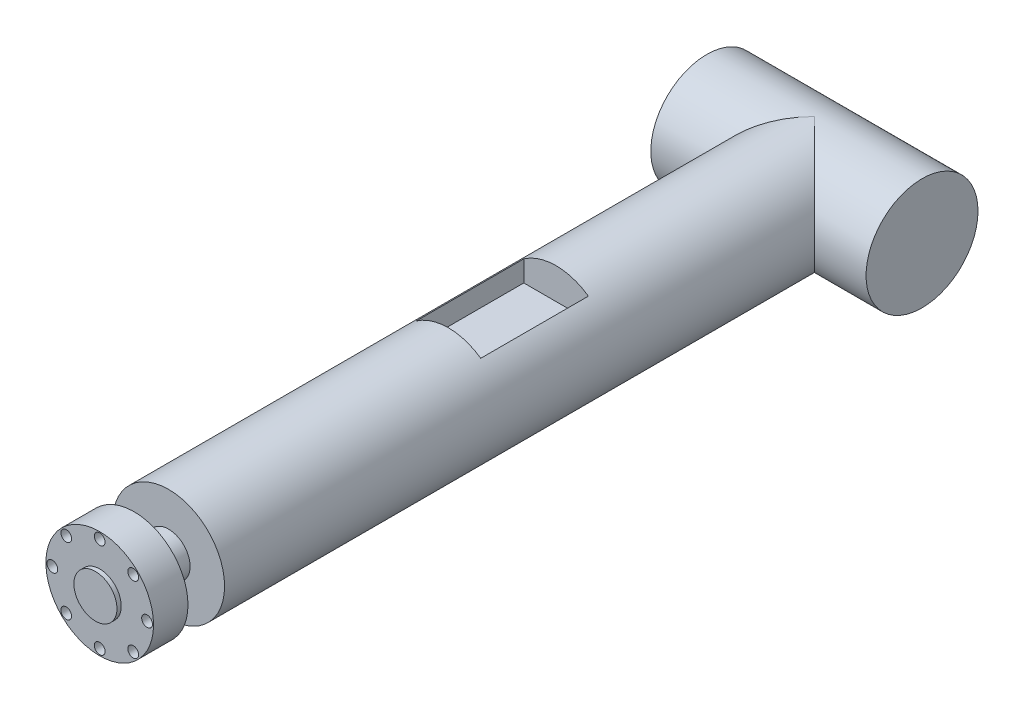
ISO-10303-21;
HEADER;
FILE_DESCRIPTION(('STEP AP214'),'2;1');
FILE_NAME('part.step','',(''),(''),'','','');
FILE_SCHEMA(('AUTOMOTIVE_DESIGN { 1 0 10303 214 1 1 1 1 }'));
ENDSEC;
DATA;
#1=APPLICATION_CONTEXT('core data for automotive mechanical design processes');
#2=APPLICATION_PROTOCOL_DEFINITION('international standard','automotive_design',2000,#1);
#3=PRODUCT_CONTEXT('',#1,'mechanical');
#4=PRODUCT('Part','Part','',(#3));
#5=PRODUCT_RELATED_PRODUCT_CATEGORY('part','',(#4));
#6=PRODUCT_DEFINITION_FORMATION('','',#4);
#7=PRODUCT_DEFINITION_CONTEXT('part definition',#1,'design');
#8=PRODUCT_DEFINITION('design','',#6,#7);
#9=PRODUCT_DEFINITION_SHAPE('','',#8);
#10=(LENGTH_UNIT() NAMED_UNIT(*) SI_UNIT(.MILLI.,.METRE.));
#11=(NAMED_UNIT(*) PLANE_ANGLE_UNIT() SI_UNIT($,.RADIAN.));
#12=(NAMED_UNIT(*) SI_UNIT($,.STERADIAN.) SOLID_ANGLE_UNIT());
#13=UNCERTAINTY_MEASURE_WITH_UNIT(LENGTH_MEASURE(1.E-05),#10,'distance_accuracy_value','');
#14=(GEOMETRIC_REPRESENTATION_CONTEXT(3) GLOBAL_UNCERTAINTY_ASSIGNED_CONTEXT((#13)) GLOBAL_UNIT_ASSIGNED_CONTEXT((#10,
#11,#12)) REPRESENTATION_CONTEXT('',''));
#15=CARTESIAN_POINT('',(0.,0.,0.));
#16=DIRECTION('',(0.,0.,1.));
#17=DIRECTION('',(1.,0.,0.));
#18=AXIS2_PLACEMENT_3D('',#15,#16,#17);
#19=CARTESIAN_POINT('',(0.,0.,150.));
#20=DIRECTION('',(0.,0.,-1.));
#21=DIRECTION('',(-1.,0.,0.));
#22=AXIS2_PLACEMENT_3D('',#19,#20,#21);
#23=CYLINDRICAL_SURFACE('',#22,13.);
#24=CARTESIAN_POINT('',(0.,0.,150.));
#25=DIRECTION('',(0.,0.,1.));
#26=DIRECTION('',(1.,0.,0.));
#27=AXIS2_PLACEMENT_3D('',#24,#25,#26);
#28=CIRCLE('',#27,13.);
#29=CARTESIAN_POINT('',(13.,0.,150.));
#30=VERTEX_POINT('',#29);
#31=EDGE_CURVE('E172',#30,#30,#28,.T.);
#32=ORIENTED_EDGE('',*,*,#31,.F.);
#33=EDGE_LOOP('',(#32));
#34=FACE_BOUND('',#33,.T.);
#35=CARTESIAN_POINT('',(0.,0.,0.));
#36=DIRECTION('',(0.707106781186547,0.,-0.707106781186547));
#37=DIRECTION('',(0.707106781186547,0.,0.707106781186547));
#38=AXIS2_PLACEMENT_3D('',#35,#36,#37);
#39=ELLIPSE('',#38,18.3847763108502,13.);
#40=CARTESIAN_POINT('',(0.,13.,0.));
#41=VERTEX_POINT('',#40);
#42=CARTESIAN_POINT('',(0.,-13.,0.));
#43=VERTEX_POINT('',#42);
#44=EDGE_CURVE('E56',#41,#43,#39,.T.);
#45=ORIENTED_EDGE('',*,*,#44,.F.);
#46=CARTESIAN_POINT('',(0.,0.,0.));
#47=DIRECTION('',(0.707106781186547,0.,0.707106781186547));
#48=DIRECTION('',(0.707106781186547,0.,-0.707106781186547));
#49=AXIS2_PLACEMENT_3D('',#46,#47,#48);
#50=ELLIPSE('',#49,18.3847763108502,13.);
#51=EDGE_CURVE('E186',#43,#41,#50,.F.);
#52=ORIENTED_EDGE('',*,*,#51,.F.);
#53=EDGE_LOOP('',(#45,#52));
#54=FACE_BOUND('',#53,.T.);
#55=DIRECTION('',(0.,0.,-1.));
#56=VECTOR('',#55,1.);
#57=CARTESIAN_POINT('',(7.49999999999998,10.6183802907977,150.));
#58=LINE('',#57,#56);
#59=CARTESIAN_POINT('',(7.5,10.6183802907977,59.9999999999999));
#60=VERTEX_POINT('',#59);
#61=CARTESIAN_POINT('',(7.5,10.6183802907977,84.9999999999999));
#62=VERTEX_POINT('',#61);
#63=EDGE_CURVE('E93',#60,#62,#58,.F.);
#64=ORIENTED_EDGE('',*,*,#63,.T.);
#65=CARTESIAN_POINT('',(0.,0.,85.));
#66=DIRECTION('',(0.,0.,-1.));
#67=DIRECTION('',(0.,1.,0.));
#68=AXIS2_PLACEMENT_3D('',#65,#66,#67);
#69=CIRCLE('',#68,13.);
#70=CARTESIAN_POINT('',(-7.5,10.6183802907977,84.9999999999999));
#71=VERTEX_POINT('',#70);
#72=EDGE_CURVE('E79',#62,#71,#69,.F.);
#73=ORIENTED_EDGE('',*,*,#72,.T.);
#74=DIRECTION('',(0.,0.,-1.));
#75=VECTOR('',#74,1.);
#76=CARTESIAN_POINT('',(-7.49999999999998,10.6183802907977,150.));
#77=LINE('',#76,#75);
#78=CARTESIAN_POINT('',(-7.49999999999998,10.6183802907977,59.9999999999999));
#79=VERTEX_POINT('',#78);
#80=EDGE_CURVE('E104',#71,#79,#77,.T.);
#81=ORIENTED_EDGE('',*,*,#80,.T.);
#82=CARTESIAN_POINT('',(0.,0.,60.));
#83=DIRECTION('',(0.,0.,1.));
#84=DIRECTION('',(0.,-1.,0.));
#85=AXIS2_PLACEMENT_3D('',#82,#83,#84);
#86=CIRCLE('',#85,13.);
#87=EDGE_CURVE('E100',#79,#60,#86,.F.);
#88=ORIENTED_EDGE('',*,*,#87,.T.);
#89=EDGE_LOOP('',(#64,#73,#81,#88));
#90=FACE_BOUND('',#89,.T.);
#91=ADVANCED_FACE('F33',(#34,#54,#90),#23,.T.);
#92=CARTESIAN_POINT('',(0.,0.,166.));
#93=DIRECTION('',(0.,0.,-1.));
#94=DIRECTION('',(-1.,0.,0.));
#95=AXIS2_PLACEMENT_3D('',#92,#93,#94);
#96=CYLINDRICAL_SURFACE('',#95,5.);
#97=CARTESIAN_POINT('',(0.,0.,150.));
#98=DIRECTION('',(0.,0.,1.));
#99=DIRECTION('',(1.,0.,0.));
#100=AXIS2_PLACEMENT_3D('',#97,#98,#99);
#101=CIRCLE('',#100,5.);
#102=CARTESIAN_POINT('',(5.,0.,150.));
#103=VERTEX_POINT('',#102);
#104=EDGE_CURVE('E175',#103,#103,#101,.T.);
#105=ORIENTED_EDGE('',*,*,#104,.T.);
#106=EDGE_LOOP('',(#105));
#107=FACE_BOUND('',#106,.T.);
#108=CARTESIAN_POINT('',(0.,0.,158.));
#109=DIRECTION('',(0.,0.,1.));
#110=DIRECTION('',(1.,0.,0.));
#111=AXIS2_PLACEMENT_3D('',#108,#109,#110);
#112=CIRCLE('',#111,5.);
#113=CARTESIAN_POINT('',(5.,0.,158.));
#114=VERTEX_POINT('',#113);
#115=EDGE_CURVE('E37',#114,#114,#112,.T.);
#116=ORIENTED_EDGE('',*,*,#115,.F.);
#117=EDGE_LOOP('',(#116));
#118=FACE_BOUND('',#117,.T.);
#119=ADVANCED_FACE('F189',(#107,#118),#96,.T.);
#120=CARTESIAN_POINT('',(-25.,0.,0.));
#121=DIRECTION('',(1.,0.,0.));
#122=DIRECTION('',(0.,0.,-1.));
#123=AXIS2_PLACEMENT_3D('',#120,#121,#122);
#124=CYLINDRICAL_SURFACE('',#123,13.);
#125=CARTESIAN_POINT('',(-25.,0.,0.));
#126=DIRECTION('',(1.,0.,0.));
#127=DIRECTION('',(0.,0.,-1.));
#128=AXIS2_PLACEMENT_3D('',#125,#126,#127);
#129=CIRCLE('',#128,13.);
#130=CARTESIAN_POINT('',(-25.,0.,-13.));
#131=VERTEX_POINT('',#130);
#132=EDGE_CURVE('E183',#131,#131,#129,.T.);
#133=ORIENTED_EDGE('',*,*,#132,.T.);
#134=EDGE_LOOP('',(#133));
#135=FACE_BOUND('',#134,.T.);
#136=CARTESIAN_POINT('',(25.,0.,0.));
#137=DIRECTION('',(1.,0.,0.));
#138=DIRECTION('',(0.,0.,-1.));
#139=AXIS2_PLACEMENT_3D('',#136,#137,#138);
#140=CIRCLE('',#139,13.);
#141=CARTESIAN_POINT('',(25.,0.,-13.));
#142=VERTEX_POINT('',#141);
#143=EDGE_CURVE('E180',#142,#142,#140,.T.);
#144=ORIENTED_EDGE('',*,*,#143,.F.);
#145=EDGE_LOOP('',(#144));
#146=FACE_BOUND('',#145,.T.);
#147=ORIENTED_EDGE('',*,*,#51,.T.);
#148=ORIENTED_EDGE('',*,*,#44,.T.);
#149=EDGE_LOOP('',(#147,#148));
#150=FACE_BOUND('',#149,.T.);
#151=ADVANCED_FACE('F35',(#135,#146,#150),#124,.T.);
#152=CARTESIAN_POINT('',(-25.,0.,0.));
#153=DIRECTION('',(1.,0.,0.));
#154=DIRECTION('',(0.,0.,-1.));
#155=AXIS2_PLACEMENT_3D('',#152,#153,#154);
#156=PLANE('',#155);
#157=ORIENTED_EDGE('',*,*,#132,.F.);
#158=EDGE_LOOP('',(#157));
#159=FACE_BOUND('',#158,.T.);
#160=ADVANCED_FACE('F203',(#159),#156,.F.);
#161=CARTESIAN_POINT('',(25.,0.,0.));
#162=DIRECTION('',(1.,0.,0.));
#163=DIRECTION('',(0.,0.,-1.));
#164=AXIS2_PLACEMENT_3D('',#161,#162,#163);
#165=PLANE('',#164);
#166=ORIENTED_EDGE('',*,*,#143,.T.);
#167=EDGE_LOOP('',(#166));
#168=FACE_BOUND('',#167,.T.);
#169=ADVANCED_FACE('F201',(#168),#165,.T.);
#170=CARTESIAN_POINT('',(0.,0.,150.));
#171=DIRECTION('',(0.,0.,1.));
#172=DIRECTION('',(1.,0.,0.));
#173=AXIS2_PLACEMENT_3D('',#170,#171,#172);
#174=PLANE('',#173);
#175=ORIENTED_EDGE('',*,*,#104,.F.);
#176=EDGE_LOOP('',(#175));
#177=FACE_BOUND('',#176,.T.);
#178=ORIENTED_EDGE('',*,*,#31,.T.);
#179=EDGE_LOOP('',(#178));
#180=FACE_BOUND('',#179,.T.);
#181=ADVANCED_FACE('F200',(#177,#180),#174,.T.);
#182=CARTESIAN_POINT('',(0.,0.,158.));
#183=DIRECTION('',(0.,0.,1.));
#184=DIRECTION('',(1.,0.,0.));
#185=AXIS2_PLACEMENT_3D('',#182,#183,#184);
#186=CYLINDRICAL_SURFACE('',#185,12.5);
#187=CARTESIAN_POINT('',(0.,0.,158.));
#188=DIRECTION('',(0.,0.,1.));
#189=DIRECTION('',(1.,0.,0.));
#190=AXIS2_PLACEMENT_3D('',#187,#188,#189);
#191=CIRCLE('',#190,12.5);
#192=CARTESIAN_POINT('',(12.5,0.,158.));
#193=VERTEX_POINT('',#192);
#194=EDGE_CURVE('E169',#193,#193,#191,.T.);
#195=ORIENTED_EDGE('',*,*,#194,.T.);
#196=EDGE_LOOP('',(#195));
#197=FACE_BOUND('',#196,.T.);
#198=CARTESIAN_POINT('',(0.,0.,166.));
#199=DIRECTION('',(0.,0.,1.));
#200=DIRECTION('',(1.,0.,0.));
#201=AXIS2_PLACEMENT_3D('',#198,#199,#200);
#202=CIRCLE('',#201,12.5);
#203=CARTESIAN_POINT('',(12.5,0.,166.));
#204=VERTEX_POINT('',#203);
#205=EDGE_CURVE('E167',#204,#204,#202,.T.);
#206=ORIENTED_EDGE('',*,*,#205,.F.);
#207=EDGE_LOOP('',(#206));
#208=FACE_BOUND('',#207,.T.);
#209=ADVANCED_FACE('F232',(#197,#208),#186,.T.);
#210=CARTESIAN_POINT('',(0.,0.,158.));
#211=DIRECTION('',(0.,0.,1.));
#212=DIRECTION('',(1.,0.,0.));
#213=AXIS2_PLACEMENT_3D('',#210,#211,#212);
#214=PLANE('',#213);
#215=CARTESIAN_POINT('',(-10.9999999999991,-9.37916411203332E-13,158.));
#216=DIRECTION('',(0.,0.,1.));
#217=DIRECTION('',(1.,0.,0.));
#218=AXIS2_PLACEMENT_3D('',#215,#216,#217);
#219=CIRCLE('',#218,1.25000000000128);
#220=CARTESIAN_POINT('',(-9.74999999999778,-9.37916411203332E-13,158.));
#221=VERTEX_POINT('',#220);
#222=EDGE_CURVE('E121',#221,#221,#219,.F.);
#223=ORIENTED_EDGE('',*,*,#222,.F.);
#224=EDGE_LOOP('',(#223));
#225=FACE_BOUND('',#224,.T.);
#226=CARTESIAN_POINT('',(0.,11.,158.));
#227=DIRECTION('',(0.,0.,1.));
#228=DIRECTION('',(1.,0.,0.));
#229=AXIS2_PLACEMENT_3D('',#226,#227,#228);
#230=CIRCLE('',#229,1.25);
#231=CARTESIAN_POINT('',(1.25,11.,158.));
#232=VERTEX_POINT('',#231);
#233=EDGE_CURVE('E87',#232,#232,#230,.F.);
#234=ORIENTED_EDGE('',*,*,#233,.F.);
#235=EDGE_LOOP('',(#234));
#236=FACE_BOUND('',#235,.T.);
#237=CARTESIAN_POINT('',(1.87313859944854E-12,-11.,158.));
#238=DIRECTION('',(0.,0.,1.));
#239=DIRECTION('',(1.,0.,0.));
#240=AXIS2_PLACEMENT_3D('',#237,#238,#239);
#241=CIRCLE('',#240,1.25000000000186);
#242=CARTESIAN_POINT('',(1.25000000000374,-11.,158.));
#243=VERTEX_POINT('',#242);
#244=EDGE_CURVE('E134',#243,#243,#241,.F.);
#245=ORIENTED_EDGE('',*,*,#244,.F.);
#246=EDGE_LOOP('',(#245));
#247=FACE_BOUND('',#246,.T.);
#248=CARTESIAN_POINT('',(-7.77817459305042,-7.77817459305269,158.));
#249=DIRECTION('',(0.,0.,1.));
#250=DIRECTION('',(1.,0.,0.));
#251=AXIS2_PLACEMENT_3D('',#248,#249,#250);
#252=CIRCLE('',#251,1.25000000000181);
#253=CARTESIAN_POINT('',(-6.52817459304861,-7.77817459305269,158.));
#254=VERTEX_POINT('',#253);
#255=EDGE_CURVE('E126',#254,#254,#252,.F.);
#256=ORIENTED_EDGE('',*,*,#255,.F.);
#257=EDGE_LOOP('',(#256));
#258=FACE_BOUND('',#257,.T.);
#259=CARTESIAN_POINT('',(7.77817459305362,-7.77817459305136,158.));
#260=DIRECTION('',(0.,0.,1.));
#261=DIRECTION('',(1.,0.,0.));
#262=AXIS2_PLACEMENT_3D('',#259,#260,#261);
#263=CIRCLE('',#262,1.25000000000139);
#264=CARTESIAN_POINT('',(9.02817459305501,-7.77817459305136,158.));
#265=VERTEX_POINT('',#264);
#266=EDGE_CURVE('E133',#265,#265,#263,.F.);
#267=ORIENTED_EDGE('',*,*,#266,.F.);
#268=EDGE_LOOP('',(#267));
#269=FACE_BOUND('',#268,.T.);
#270=CARTESIAN_POINT('',(11.0000000000009,9.3656929972427E-13,158.));
#271=DIRECTION('',(0.,0.,1.));
#272=DIRECTION('',(1.,0.,0.));
#273=AXIS2_PLACEMENT_3D('',#270,#271,#272);
#274=CIRCLE('',#273,1.25000000000066);
#275=CARTESIAN_POINT('',(12.2500000000016,9.3656929972427E-13,158.));
#276=VERTEX_POINT('',#275);
#277=EDGE_CURVE('E156',#276,#276,#274,.F.);
#278=ORIENTED_EDGE('',*,*,#277,.F.);
#279=EDGE_LOOP('',(#278));
#280=FACE_BOUND('',#279,.T.);
#281=CARTESIAN_POINT('',(7.7781745930523,7.77817459305268,158.));
#282=DIRECTION('',(0.,0.,1.));
#283=DIRECTION('',(1.,0.,0.));
#284=AXIS2_PLACEMENT_3D('',#281,#282,#283);
#285=CIRCLE('',#284,1.25000000000009);
#286=CARTESIAN_POINT('',(9.02817459305238,7.77817459305268,158.));
#287=VERTEX_POINT('',#286);
#288=EDGE_CURVE('E150',#287,#287,#285,.F.);
#289=ORIENTED_EDGE('',*,*,#288,.F.);
#290=EDGE_LOOP('',(#289));
#291=FACE_BOUND('',#290,.T.);
#292=CARTESIAN_POINT('',(-7.77817459305175,7.77817459305136,158.));
#293=DIRECTION('',(0.,0.,1.));
#294=DIRECTION('',(1.,0.,0.));
#295=AXIS2_PLACEMENT_3D('',#292,#293,#294);
#296=CIRCLE('',#295,1.25000000000059);
#297=CARTESIAN_POINT('',(-6.52817459305116,7.77817459305136,158.));
#298=VERTEX_POINT('',#297);
#299=EDGE_CURVE('E144',#298,#298,#296,.F.);
#300=ORIENTED_EDGE('',*,*,#299,.F.);
#301=EDGE_LOOP('',(#300));
#302=FACE_BOUND('',#301,.T.);
#303=ORIENTED_EDGE('',*,*,#115,.T.);
#304=EDGE_LOOP('',(#303));
#305=FACE_BOUND('',#304,.T.);
#306=ORIENTED_EDGE('',*,*,#194,.F.);
#307=EDGE_LOOP('',(#306));
#308=FACE_BOUND('',#307,.T.);
#309=ADVANCED_FACE('F236',(#225,#236,#247,#258,#269,#280,#291,#302,#305,#308),#214,.F.);
#310=CARTESIAN_POINT('',(0.,0.,166.));
#311=DIRECTION('',(0.,0.,1.));
#312=DIRECTION('',(1.,0.,0.));
#313=AXIS2_PLACEMENT_3D('',#310,#311,#312);
#314=PLANE('',#313);
#315=CARTESIAN_POINT('',(-10.9999999999991,-9.37916411203332E-13,166.));
#316=DIRECTION('',(0.,0.,1.));
#317=DIRECTION('',(1.,0.,0.));
#318=AXIS2_PLACEMENT_3D('',#315,#316,#317);
#319=CIRCLE('',#318,1.25000000000128);
#320=CARTESIAN_POINT('',(-9.74999999999778,-9.37916411203332E-13,166.));
#321=VERTEX_POINT('',#320);
#322=EDGE_CURVE('E118',#321,#321,#319,.T.);
#323=ORIENTED_EDGE('',*,*,#322,.F.);
#324=EDGE_LOOP('',(#323));
#325=FACE_BOUND('',#324,.T.);
#326=CARTESIAN_POINT('',(0.,11.,166.));
#327=DIRECTION('',(0.,0.,1.));
#328=DIRECTION('',(1.,0.,0.));
#329=AXIS2_PLACEMENT_3D('',#326,#327,#328);
#330=CIRCLE('',#329,1.25);
#331=CARTESIAN_POINT('',(1.25,11.,166.));
#332=VERTEX_POINT('',#331);
#333=EDGE_CURVE('E137',#332,#332,#330,.T.);
#334=ORIENTED_EDGE('',*,*,#333,.F.);
#335=EDGE_LOOP('',(#334));
#336=FACE_BOUND('',#335,.T.);
#337=CARTESIAN_POINT('',(1.87313859944854E-12,-11.,166.));
#338=DIRECTION('',(0.,0.,1.));
#339=DIRECTION('',(1.,0.,0.));
#340=AXIS2_PLACEMENT_3D('',#337,#338,#339);
#341=CIRCLE('',#340,1.25000000000186);
#342=CARTESIAN_POINT('',(1.25000000000374,-11.,166.));
#343=VERTEX_POINT('',#342);
#344=EDGE_CURVE('E130',#343,#343,#341,.T.);
#345=ORIENTED_EDGE('',*,*,#344,.F.);
#346=EDGE_LOOP('',(#345));
#347=FACE_BOUND('',#346,.T.);
#348=CARTESIAN_POINT('',(-7.77817459305042,-7.77817459305269,166.));
#349=DIRECTION('',(0.,0.,1.));
#350=DIRECTION('',(1.,0.,0.));
#351=AXIS2_PLACEMENT_3D('',#348,#349,#350);
#352=CIRCLE('',#351,1.25000000000181);
#353=CARTESIAN_POINT('',(-6.52817459304861,-7.77817459305269,166.));
#354=VERTEX_POINT('',#353);
#355=EDGE_CURVE('E129',#354,#354,#352,.T.);
#356=ORIENTED_EDGE('',*,*,#355,.F.);
#357=EDGE_LOOP('',(#356));
#358=FACE_BOUND('',#357,.T.);
#359=CARTESIAN_POINT('',(7.77817459305362,-7.77817459305136,166.));
#360=DIRECTION('',(0.,0.,1.));
#361=DIRECTION('',(1.,0.,0.));
#362=AXIS2_PLACEMENT_3D('',#359,#360,#361);
#363=CIRCLE('',#362,1.25000000000139);
#364=CARTESIAN_POINT('',(9.02817459305501,-7.77817459305136,166.));
#365=VERTEX_POINT('',#364);
#366=EDGE_CURVE('E159',#365,#365,#363,.T.);
#367=ORIENTED_EDGE('',*,*,#366,.F.);
#368=EDGE_LOOP('',(#367));
#369=FACE_BOUND('',#368,.T.);
#370=CARTESIAN_POINT('',(11.0000000000009,9.3656929972427E-13,166.));
#371=DIRECTION('',(0.,0.,1.));
#372=DIRECTION('',(1.,0.,0.));
#373=AXIS2_PLACEMENT_3D('',#370,#371,#372);
#374=CIRCLE('',#373,1.25000000000066);
#375=CARTESIAN_POINT('',(12.2500000000016,9.3656929972427E-13,166.));
#376=VERTEX_POINT('',#375);
#377=EDGE_CURVE('E153',#376,#376,#374,.T.);
#378=ORIENTED_EDGE('',*,*,#377,.F.);
#379=EDGE_LOOP('',(#378));
#380=FACE_BOUND('',#379,.T.);
#381=CARTESIAN_POINT('',(7.7781745930523,7.77817459305268,166.));
#382=DIRECTION('',(0.,0.,1.));
#383=DIRECTION('',(1.,0.,0.));
#384=AXIS2_PLACEMENT_3D('',#381,#382,#383);
#385=CIRCLE('',#384,1.25000000000009);
#386=CARTESIAN_POINT('',(9.02817459305238,7.77817459305268,166.));
#387=VERTEX_POINT('',#386);
#388=EDGE_CURVE('E147',#387,#387,#385,.T.);
#389=ORIENTED_EDGE('',*,*,#388,.F.);
#390=EDGE_LOOP('',(#389));
#391=FACE_BOUND('',#390,.T.);
#392=CARTESIAN_POINT('',(-7.77817459305175,7.77817459305136,166.));
#393=DIRECTION('',(0.,0.,1.));
#394=DIRECTION('',(1.,0.,0.));
#395=AXIS2_PLACEMENT_3D('',#392,#393,#394);
#396=CIRCLE('',#395,1.25000000000059);
#397=CARTESIAN_POINT('',(-6.52817459305116,7.77817459305136,166.));
#398=VERTEX_POINT('',#397);
#399=EDGE_CURVE('E122',#398,#398,#396,.T.);
#400=ORIENTED_EDGE('',*,*,#399,.F.);
#401=EDGE_LOOP('',(#400));
#402=FACE_BOUND('',#401,.T.);
#403=CARTESIAN_POINT('',(0.,0.,166.));
#404=DIRECTION('',(0.,0.,1.));
#405=DIRECTION('',(1.,0.,0.));
#406=AXIS2_PLACEMENT_3D('',#403,#404,#405);
#407=CIRCLE('',#406,5.);
#408=CARTESIAN_POINT('',(5.,0.,166.));
#409=VERTEX_POINT('',#408);
#410=EDGE_CURVE('E11',#409,#409,#407,.T.);
#411=ORIENTED_EDGE('',*,*,#410,.F.);
#412=EDGE_LOOP('',(#411));
#413=FACE_BOUND('',#412,.T.);
#414=ORIENTED_EDGE('',*,*,#205,.T.);
#415=EDGE_LOOP('',(#414));
#416=FACE_BOUND('',#415,.T.);
#417=ADVANCED_FACE('F250',(#325,#336,#347,#358,#369,#380,#391,#402,#413,#416),#314,.T.);
#418=CARTESIAN_POINT('',(0.,0.,167.));
#419=DIRECTION('',(0.,0.,-1.));
#420=DIRECTION('',(-1.,0.,0.));
#421=AXIS2_PLACEMENT_3D('',#418,#419,#420);
#422=CYLINDRICAL_SURFACE('',#421,5.);
#423=CARTESIAN_POINT('',(0.,0.,167.));
#424=DIRECTION('',(0.,0.,1.));
#425=DIRECTION('',(1.,0.,0.));
#426=AXIS2_PLACEMENT_3D('',#423,#424,#425);
#427=CIRCLE('',#426,5.);
#428=CARTESIAN_POINT('',(5.,0.,167.));
#429=VERTEX_POINT('',#428);
#430=EDGE_CURVE('E125',#429,#429,#427,.T.);
#431=ORIENTED_EDGE('',*,*,#430,.F.);
#432=EDGE_LOOP('',(#431));
#433=FACE_BOUND('',#432,.T.);
#434=ORIENTED_EDGE('',*,*,#410,.T.);
#435=EDGE_LOOP('',(#434));
#436=FACE_BOUND('',#435,.T.);
#437=ADVANCED_FACE('F244',(#433,#436),#422,.T.);
#438=CARTESIAN_POINT('',(0.,0.,167.));
#439=DIRECTION('',(0.,0.,1.));
#440=DIRECTION('',(1.,0.,0.));
#441=AXIS2_PLACEMENT_3D('',#438,#439,#440);
#442=PLANE('',#441);
#443=ORIENTED_EDGE('',*,*,#430,.T.);
#444=EDGE_LOOP('',(#443));
#445=FACE_BOUND('',#444,.T.);
#446=ADVANCED_FACE('F249',(#445),#442,.T.);
#447=CARTESIAN_POINT('',(-7.77817459305175,7.77817459305136,-13.001));
#448=DIRECTION('',(0.,0.,1.));
#449=DIRECTION('',(1.,0.,0.));
#450=AXIS2_PLACEMENT_3D('',#447,#448,#449);
#451=CYLINDRICAL_SURFACE('',#450,1.25000000000059);
#452=ORIENTED_EDGE('',*,*,#399,.T.);
#453=EDGE_LOOP('',(#452));
#454=FACE_BOUND('',#453,.T.);
#455=ORIENTED_EDGE('',*,*,#299,.T.);
#456=EDGE_LOOP('',(#455));
#457=FACE_BOUND('',#456,.T.);
#458=ADVANCED_FACE('F262',(#454,#457),#451,.F.);
#459=CARTESIAN_POINT('',(7.7781745930523,7.77817459305268,-13.001));
#460=DIRECTION('',(0.,0.,1.));
#461=DIRECTION('',(1.,0.,0.));
#462=AXIS2_PLACEMENT_3D('',#459,#460,#461);
#463=CYLINDRICAL_SURFACE('',#462,1.25000000000009);
#464=ORIENTED_EDGE('',*,*,#388,.T.);
#465=EDGE_LOOP('',(#464));
#466=FACE_BOUND('',#465,.T.);
#467=ORIENTED_EDGE('',*,*,#288,.T.);
#468=EDGE_LOOP('',(#467));
#469=FACE_BOUND('',#468,.T.);
#470=ADVANCED_FACE('F286',(#466,#469),#463,.F.);
#471=CARTESIAN_POINT('',(11.0000000000009,9.3656929972427E-13,-13.001));
#472=DIRECTION('',(0.,0.,1.));
#473=DIRECTION('',(1.,0.,0.));
#474=AXIS2_PLACEMENT_3D('',#471,#472,#473);
#475=CYLINDRICAL_SURFACE('',#474,1.25000000000066);
#476=ORIENTED_EDGE('',*,*,#377,.T.);
#477=EDGE_LOOP('',(#476));
#478=FACE_BOUND('',#477,.T.);
#479=ORIENTED_EDGE('',*,*,#277,.T.);
#480=EDGE_LOOP('',(#479));
#481=FACE_BOUND('',#480,.T.);
#482=ADVANCED_FACE('F296',(#478,#481),#475,.F.);
#483=CARTESIAN_POINT('',(7.77817459305362,-7.77817459305136,-13.001));
#484=DIRECTION('',(0.,0.,1.));
#485=DIRECTION('',(1.,0.,0.));
#486=AXIS2_PLACEMENT_3D('',#483,#484,#485);
#487=CYLINDRICAL_SURFACE('',#486,1.25000000000139);
#488=ORIENTED_EDGE('',*,*,#366,.T.);
#489=EDGE_LOOP('',(#488));
#490=FACE_BOUND('',#489,.T.);
#491=ORIENTED_EDGE('',*,*,#266,.T.);
#492=EDGE_LOOP('',(#491));
#493=FACE_BOUND('',#492,.T.);
#494=ADVANCED_FACE('F306',(#490,#493),#487,.F.);
#495=CARTESIAN_POINT('',(-7.77817459305042,-7.77817459305269,-13.001));
#496=DIRECTION('',(0.,0.,1.));
#497=DIRECTION('',(1.,0.,0.));
#498=AXIS2_PLACEMENT_3D('',#495,#496,#497);
#499=CYLINDRICAL_SURFACE('',#498,1.25000000000181);
#500=ORIENTED_EDGE('',*,*,#355,.T.);
#501=EDGE_LOOP('',(#500));
#502=FACE_BOUND('',#501,.T.);
#503=ORIENTED_EDGE('',*,*,#255,.T.);
#504=EDGE_LOOP('',(#503));
#505=FACE_BOUND('',#504,.T.);
#506=ADVANCED_FACE('F316',(#502,#505),#499,.F.);
#507=CARTESIAN_POINT('',(1.87313859944854E-12,-11.,-13.001));
#508=DIRECTION('',(0.,0.,1.));
#509=DIRECTION('',(1.,0.,0.));
#510=AXIS2_PLACEMENT_3D('',#507,#508,#509);
#511=CYLINDRICAL_SURFACE('',#510,1.25000000000186);
#512=ORIENTED_EDGE('',*,*,#344,.T.);
#513=EDGE_LOOP('',(#512));
#514=FACE_BOUND('',#513,.T.);
#515=ORIENTED_EDGE('',*,*,#244,.T.);
#516=EDGE_LOOP('',(#515));
#517=FACE_BOUND('',#516,.T.);
#518=ADVANCED_FACE('F326',(#514,#517),#511,.F.);
#519=CARTESIAN_POINT('',(0.,11.,-13.001));
#520=DIRECTION('',(0.,0.,1.));
#521=DIRECTION('',(1.,0.,0.));
#522=AXIS2_PLACEMENT_3D('',#519,#520,#521);
#523=CYLINDRICAL_SURFACE('',#522,1.25);
#524=ORIENTED_EDGE('',*,*,#333,.T.);
#525=EDGE_LOOP('',(#524));
#526=FACE_BOUND('',#525,.T.);
#527=ORIENTED_EDGE('',*,*,#233,.T.);
#528=EDGE_LOOP('',(#527));
#529=FACE_BOUND('',#528,.T.);
#530=ADVANCED_FACE('F336',(#526,#529),#523,.F.);
#531=CARTESIAN_POINT('',(-10.9999999999991,-9.37916411203332E-13,-13.001));
#532=DIRECTION('',(0.,0.,1.));
#533=DIRECTION('',(1.,0.,0.));
#534=AXIS2_PLACEMENT_3D('',#531,#532,#533);
#535=CYLINDRICAL_SURFACE('',#534,1.25000000000128);
#536=ORIENTED_EDGE('',*,*,#322,.T.);
#537=EDGE_LOOP('',(#536));
#538=FACE_BOUND('',#537,.T.);
#539=ORIENTED_EDGE('',*,*,#222,.T.);
#540=EDGE_LOOP('',(#539));
#541=FACE_BOUND('',#540,.T.);
#542=ADVANCED_FACE('F346',(#538,#541),#535,.F.);
#543=CARTESIAN_POINT('',(7.5,13.0010000000005,59.9999999999999));
#544=DIRECTION('',(-1.,0.,0.));
#545=DIRECTION('',(0.,0.,1.));
#546=AXIS2_PLACEMENT_3D('',#543,#544,#545);
#547=PLANE('',#546);
#548=DIRECTION('',(0.,-1.,0.));
#549=VECTOR('',#548,1.);
#550=CARTESIAN_POINT('',(7.5,13.0010000000005,59.9999999999999));
#551=LINE('',#550,#549);
#552=CARTESIAN_POINT('',(7.5,5.77121927435329,60.));
#553=VERTEX_POINT('',#552);
#554=EDGE_CURVE('E88',#60,#553,#551,.T.);
#555=ORIENTED_EDGE('',*,*,#554,.T.);
#556=DIRECTION('',(0.,0.,-1.));
#557=VECTOR('',#556,1.);
#558=CARTESIAN_POINT('',(7.5,5.77121927435329,60.));
#559=LINE('',#558,#557);
#560=CARTESIAN_POINT('',(7.5,5.77121927435346,85.));
#561=VERTEX_POINT('',#560);
#562=EDGE_CURVE('E96',#561,#553,#559,.T.);
#563=ORIENTED_EDGE('',*,*,#562,.F.);
#564=DIRECTION('',(0.,-1.,0.));
#565=VECTOR('',#564,1.);
#566=CARTESIAN_POINT('',(7.5,13.0010000000007,84.9999999999999));
#567=LINE('',#566,#565);
#568=EDGE_CURVE('E82',#62,#561,#567,.T.);
#569=ORIENTED_EDGE('',*,*,#568,.F.);
#570=ORIENTED_EDGE('',*,*,#63,.F.);
#571=EDGE_LOOP('',(#555,#563,#569,#570));
#572=FACE_BOUND('',#571,.T.);
#573=ADVANCED_FACE('F92',(#572),#547,.T.);
#574=CARTESIAN_POINT('',(-7.5,13.0010000000005,59.9999999999999));
#575=DIRECTION('',(0.,0.,1.));
#576=DIRECTION('',(0.,-1.,0.));
#577=AXIS2_PLACEMENT_3D('',#574,#575,#576);
#578=PLANE('',#577);
#579=DIRECTION('',(0.,-1.,0.));
#580=VECTOR('',#579,1.);
#581=CARTESIAN_POINT('',(-7.5,13.0010000000005,59.9999999999999));
#582=LINE('',#581,#580);
#583=CARTESIAN_POINT('',(-7.5,5.77121927435329,60.));
#584=VERTEX_POINT('',#583);
#585=EDGE_CURVE('E115',#79,#584,#582,.T.);
#586=ORIENTED_EDGE('',*,*,#585,.T.);
#587=DIRECTION('',(-1.,0.,0.));
#588=VECTOR('',#587,1.);
#589=CARTESIAN_POINT('',(-7.5,5.77121927435329,60.));
#590=LINE('',#589,#588);
#591=EDGE_CURVE('E102',#553,#584,#590,.T.);
#592=ORIENTED_EDGE('',*,*,#591,.F.);
#593=ORIENTED_EDGE('',*,*,#554,.F.);
#594=ORIENTED_EDGE('',*,*,#87,.F.);
#595=EDGE_LOOP('',(#586,#592,#593,#594));
#596=FACE_BOUND('',#595,.T.);
#597=ADVANCED_FACE('F369',(#596),#578,.T.);
#598=CARTESIAN_POINT('',(-7.5,13.0010000000005,59.9999999999999));
#599=DIRECTION('',(1.,0.,0.));
#600=DIRECTION('',(0.,0.,-1.));
#601=AXIS2_PLACEMENT_3D('',#598,#599,#600);
#602=PLANE('',#601);
#603=DIRECTION('',(0.,-1.,0.));
#604=VECTOR('',#603,1.);
#605=CARTESIAN_POINT('',(-7.5,13.0010000000007,84.9999999999999));
#606=LINE('',#605,#604);
#607=CARTESIAN_POINT('',(-7.5,5.77121927435346,85.));
#608=VERTEX_POINT('',#607);
#609=EDGE_CURVE('E49',#71,#608,#606,.T.);
#610=ORIENTED_EDGE('',*,*,#609,.T.);
#611=DIRECTION('',(0.,0.,1.));
#612=VECTOR('',#611,1.);
#613=CARTESIAN_POINT('',(-7.5,5.77121927435329,60.));
#614=LINE('',#613,#612);
#615=EDGE_CURVE('E110',#584,#608,#614,.T.);
#616=ORIENTED_EDGE('',*,*,#615,.F.);
#617=ORIENTED_EDGE('',*,*,#585,.F.);
#618=ORIENTED_EDGE('',*,*,#80,.F.);
#619=EDGE_LOOP('',(#610,#616,#617,#618));
#620=FACE_BOUND('',#619,.T.);
#621=ADVANCED_FACE('F378',(#620),#602,.T.);
#622=CARTESIAN_POINT('',(-7.5,13.0010000000007,84.9999999999999));
#623=DIRECTION('',(0.,0.,-1.));
#624=DIRECTION('',(0.,1.,0.));
#625=AXIS2_PLACEMENT_3D('',#622,#623,#624);
#626=PLANE('',#625);
#627=ORIENTED_EDGE('',*,*,#568,.T.);
#628=DIRECTION('',(1.,0.,0.));
#629=VECTOR('',#628,1.);
#630=CARTESIAN_POINT('',(-7.5,5.77121927435346,85.));
#631=LINE('',#630,#629);
#632=EDGE_CURVE('E97',#608,#561,#631,.T.);
#633=ORIENTED_EDGE('',*,*,#632,.F.);
#634=ORIENTED_EDGE('',*,*,#609,.F.);
#635=ORIENTED_EDGE('',*,*,#72,.F.);
#636=EDGE_LOOP('',(#627,#633,#634,#635));
#637=FACE_BOUND('',#636,.T.);
#638=ADVANCED_FACE('F81',(#637),#626,.T.);
#639=CARTESIAN_POINT('',(0.,5.77121927435287,0.));
#640=DIRECTION('',(0.,1.,0.));
#641=DIRECTION('',(0.,0.,1.));
#642=AXIS2_PLACEMENT_3D('',#639,#640,#641);
#643=PLANE('',#642);
#644=ORIENTED_EDGE('',*,*,#562,.T.);
#645=ORIENTED_EDGE('',*,*,#591,.T.);
#646=ORIENTED_EDGE('',*,*,#615,.T.);
#647=ORIENTED_EDGE('',*,*,#632,.T.);
#648=EDGE_LOOP('',(#644,#645,#646,#647));
#649=FACE_BOUND('',#648,.T.);
#650=ADVANCED_FACE('F397',(#649),#643,.T.);
#651=CLOSED_SHELL('',(#91,#119,#151,#160,#169,#181,#209,#309,#417,#437,#446,#458,#470,#482,#494,
#506,#518,#530,#542,#573,#597,#621,#638,#650));
#652=MANIFOLD_SOLID_BREP('B2',#651);
#653=ADVANCED_BREP_SHAPE_REPRESENTATION('',(#18,#652),#14);
#654=SHAPE_DEFINITION_REPRESENTATION(#9,#653);
ENDSEC;
END-ISO-10303-21;
